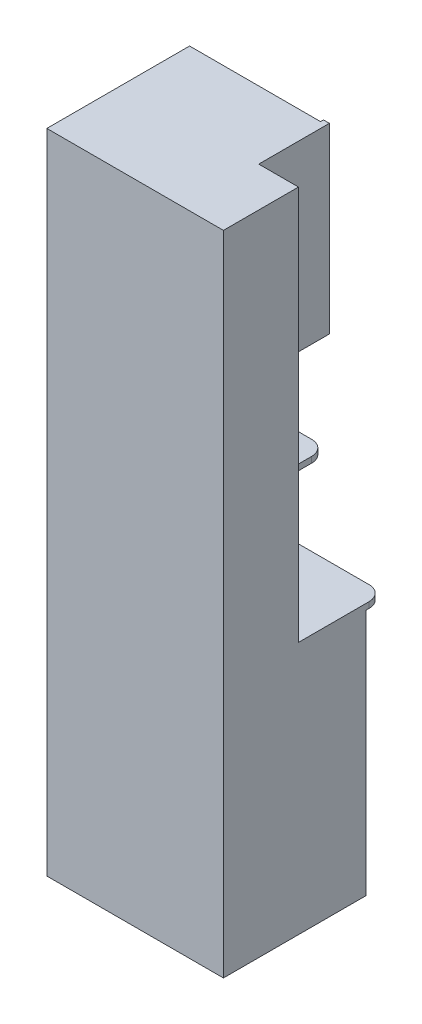
ISO-10303-21;
HEADER;
FILE_DESCRIPTION(('STEP AP214'),'2;1');
FILE_NAME('part.step','',(''),(''),'','','');
FILE_SCHEMA(('AUTOMOTIVE_DESIGN { 1 0 10303 214 1 1 1 1 }'));
ENDSEC;
DATA;
#1=APPLICATION_CONTEXT('core data for automotive mechanical design processes');
#2=APPLICATION_PROTOCOL_DEFINITION('international standard','automotive_design',2000,#1);
#3=PRODUCT_CONTEXT('',#1,'mechanical');
#4=PRODUCT('Part','Part','',(#3));
#5=PRODUCT_RELATED_PRODUCT_CATEGORY('part','',(#4));
#6=PRODUCT_DEFINITION_FORMATION('','',#4);
#7=PRODUCT_DEFINITION_CONTEXT('part definition',#1,'design');
#8=PRODUCT_DEFINITION('design','',#6,#7);
#9=PRODUCT_DEFINITION_SHAPE('','',#8);
#10=(LENGTH_UNIT() NAMED_UNIT(*) SI_UNIT(.MILLI.,.METRE.));
#11=(NAMED_UNIT(*) PLANE_ANGLE_UNIT() SI_UNIT($,.RADIAN.));
#12=(NAMED_UNIT(*) SI_UNIT($,.STERADIAN.) SOLID_ANGLE_UNIT());
#13=UNCERTAINTY_MEASURE_WITH_UNIT(LENGTH_MEASURE(1.E-05),#10,'distance_accuracy_value','');
#14=(GEOMETRIC_REPRESENTATION_CONTEXT(3) GLOBAL_UNCERTAINTY_ASSIGNED_CONTEXT((#13)) GLOBAL_UNIT_ASSIGNED_CONTEXT((#10,
#11,#12)) REPRESENTATION_CONTEXT('',''));
#15=CARTESIAN_POINT('',(0.,0.,0.));
#16=DIRECTION('',(0.,0.,1.));
#17=DIRECTION('',(1.,0.,0.));
#18=AXIS2_PLACEMENT_3D('',#15,#16,#17);
#19=CARTESIAN_POINT('',(165.,1100.,-255.));
#20=DIRECTION('',(0.,0.,1.));
#21=DIRECTION('',(0.,-1.,0.));
#22=AXIS2_PLACEMENT_3D('',#19,#20,#21);
#23=PLANE('',#22);
#24=DIRECTION('',(-1.,0.,0.));
#25=VECTOR('',#24,1.);
#26=CARTESIAN_POINT('',(165.,480.000000000001,-255.));
#27=LINE('',#26,#25);
#28=CARTESIAN_POINT('',(165.,480.000000000001,-255.));
#29=VERTEX_POINT('',#28);
#30=CARTESIAN_POINT('',(145.,480.000000000001,-255.));
#31=VERTEX_POINT('',#30);
#32=EDGE_CURVE('E196',#29,#31,#27,.T.);
#33=ORIENTED_EDGE('',*,*,#32,.F.);
#34=DIRECTION('',(0.,-1.,0.));
#35=VECTOR('',#34,1.);
#36=CARTESIAN_POINT('',(165.,1100.,-255.));
#37=LINE('',#36,#35);
#38=CARTESIAN_POINT('',(165.,1100.,-255.));
#39=VERTEX_POINT('',#38);
#40=EDGE_CURVE('E185',#39,#29,#37,.T.);
#41=ORIENTED_EDGE('',*,*,#40,.F.);
#42=DIRECTION('',(1.,0.,0.));
#43=VECTOR('',#42,1.);
#44=CARTESIAN_POINT('',(165.,1100.,-255.));
#45=LINE('',#44,#43);
#46=CARTESIAN_POINT('',(300.,1100.,-255.));
#47=VERTEX_POINT('',#46);
#48=EDGE_CURVE('E286',#39,#47,#45,.T.);
#49=ORIENTED_EDGE('',*,*,#48,.T.);
#50=DIRECTION('',(0.,-1.,0.));
#51=VECTOR('',#50,1.);
#52=CARTESIAN_POINT('',(300.,1100.,-255.));
#53=LINE('',#52,#51);
#54=CARTESIAN_POINT('',(300.,-240.,-255.));
#55=VERTEX_POINT('',#54);
#56=EDGE_CURVE('E281',#47,#55,#53,.T.);
#57=ORIENTED_EDGE('',*,*,#56,.T.);
#58=DIRECTION('',(1.,0.,0.));
#59=VECTOR('',#58,1.);
#60=CARTESIAN_POINT('',(-280.,-240.,-255.));
#61=LINE('',#60,#59);
#62=CARTESIAN_POINT('',(-280.,-240.,-255.));
#63=VERTEX_POINT('',#62);
#64=EDGE_CURVE('E226',#63,#55,#61,.T.);
#65=ORIENTED_EDGE('',*,*,#64,.F.);
#66=DIRECTION('',(0.,-1.,0.));
#67=VECTOR('',#66,1.);
#68=CARTESIAN_POINT('',(-280.,-260.,-255.));
#69=LINE('',#68,#67);
#70=CARTESIAN_POINT('',(-280.,130.,-255.));
#71=VERTEX_POINT('',#70);
#72=EDGE_CURVE('E273',#71,#63,#69,.T.);
#73=ORIENTED_EDGE('',*,*,#72,.F.);
#74=DIRECTION('',(1.,0.,0.));
#75=VECTOR('',#74,1.);
#76=CARTESIAN_POINT('',(-280.,130.,-255.));
#77=LINE('',#76,#75);
#78=CARTESIAN_POINT('',(165.,130.,-255.));
#79=VERTEX_POINT('',#78);
#80=EDGE_CURVE('E278',#71,#79,#77,.T.);
#81=ORIENTED_EDGE('',*,*,#80,.T.);
#82=DIRECTION('',(0.,-1.,0.));
#83=VECTOR('',#82,1.);
#84=CARTESIAN_POINT('',(165.,1100.,-255.));
#85=LINE('',#84,#83);
#86=CARTESIAN_POINT('',(165.,150.,-255.));
#87=VERTEX_POINT('',#86);
#88=EDGE_CURVE('E283',#87,#79,#85,.T.);
#89=ORIENTED_EDGE('',*,*,#88,.F.);
#90=DIRECTION('',(1.,0.,0.));
#91=VECTOR('',#90,1.);
#92=CARTESIAN_POINT('',(-280.,150.,-255.));
#93=LINE('',#92,#91);
#94=CARTESIAN_POINT('',(-280.,150.,-255.));
#95=VERTEX_POINT('',#94);
#96=EDGE_CURVE('E259',#95,#87,#93,.T.);
#97=ORIENTED_EDGE('',*,*,#96,.F.);
#98=DIRECTION('',(0.,-1.,0.));
#99=VECTOR('',#98,1.);
#100=CARTESIAN_POINT('',(-280.,490.,-255.));
#101=LINE('',#100,#99);
#102=CARTESIAN_POINT('',(-280.,490.,-255.));
#103=VERTEX_POINT('',#102);
#104=EDGE_CURVE('E248',#103,#95,#101,.T.);
#105=ORIENTED_EDGE('',*,*,#104,.F.);
#106=DIRECTION('',(1.,0.,0.));
#107=VECTOR('',#106,1.);
#108=CARTESIAN_POINT('',(-280.,490.,-255.));
#109=LINE('',#108,#107);
#110=CARTESIAN_POINT('',(145.,490.,-255.));
#111=VERTEX_POINT('',#110);
#112=EDGE_CURVE('E261',#103,#111,#109,.T.);
#113=ORIENTED_EDGE('',*,*,#112,.T.);
#114=DIRECTION('',(0.,-1.,0.));
#115=VECTOR('',#114,1.);
#116=CARTESIAN_POINT('',(145.,1100.,-255.));
#117=LINE('',#116,#115);
#118=EDGE_CURVE('E207',#111,#31,#117,.T.);
#119=ORIENTED_EDGE('',*,*,#118,.T.);
#120=EDGE_LOOP('',(#33,#41,#49,#57,#65,#73,#81,#89,#97,#105,#113,#119));
#121=FACE_BOUND('',#120,.T.);
#122=ADVANCED_FACE('F33',(#121),#23,.F.);
#123=CARTESIAN_POINT('',(-280.,0.,0.));
#124=DIRECTION('',(1.,0.,0.));
#125=DIRECTION('',(0.,1.,0.));
#126=AXIS2_PLACEMENT_3D('',#123,#124,#125);
#127=PLANE('',#126);
#128=ORIENTED_EDGE('',*,*,#72,.T.);
#129=DIRECTION('',(0.,0.,-1.));
#130=VECTOR('',#129,1.);
#131=CARTESIAN_POINT('',(-280.,-240.,-1.8376105235175E-13));
#132=LINE('',#131,#130);
#133=CARTESIAN_POINT('',(-280.,-240.,-485.));
#134=VERTEX_POINT('',#133);
#135=EDGE_CURVE('E319',#63,#134,#132,.T.);
#136=ORIENTED_EDGE('',*,*,#135,.T.);
#137=DIRECTION('',(0.,1.,0.));
#138=VECTOR('',#137,1.);
#139=CARTESIAN_POINT('',(-280.,-260.,-485.));
#140=LINE('',#139,#138);
#141=CARTESIAN_POINT('',(-280.,130.,-485.));
#142=VERTEX_POINT('',#141);
#143=EDGE_CURVE('E270',#134,#142,#140,.T.);
#144=ORIENTED_EDGE('',*,*,#143,.T.);
#145=DIRECTION('',(0.,0.,1.));
#146=VECTOR('',#145,1.);
#147=CARTESIAN_POINT('',(-280.,130.,-485.));
#148=LINE('',#147,#146);
#149=EDGE_CURVE('E269',#142,#71,#148,.T.);
#150=ORIENTED_EDGE('',*,*,#149,.T.);
#151=EDGE_LOOP('',(#128,#136,#144,#150));
#152=FACE_BOUND('',#151,.T.);
#153=ADVANCED_FACE('F416',(#152),#127,.T.);
#154=CARTESIAN_POINT('',(165.,0.,0.));
#155=DIRECTION('',(-1.,0.,0.));
#156=DIRECTION('',(0.,-1.,0.));
#157=AXIS2_PLACEMENT_3D('',#154,#155,#156);
#158=PLANE('',#157);
#159=DIRECTION('',(0.,0.,1.));
#160=VECTOR('',#159,1.);
#161=CARTESIAN_POINT('',(165.,130.,-485.));
#162=LINE('',#161,#160);
#163=CARTESIAN_POINT('',(165.,130.,-435.));
#164=VERTEX_POINT('',#163);
#165=EDGE_CURVE('E258',#164,#79,#162,.T.);
#166=ORIENTED_EDGE('',*,*,#165,.F.);
#167=DIRECTION('',(0.,1.,0.));
#168=VECTOR('',#167,1.);
#169=CARTESIAN_POINT('',(165.,150.,-435.));
#170=LINE('',#169,#168);
#171=CARTESIAN_POINT('',(165.,150.,-435.));
#172=VERTEX_POINT('',#171);
#173=EDGE_CURVE('E345',#164,#172,#170,.T.);
#174=ORIENTED_EDGE('',*,*,#173,.T.);
#175=DIRECTION('',(0.,0.,-1.));
#176=VECTOR('',#175,1.);
#177=CARTESIAN_POINT('',(165.,150.,-485.));
#178=LINE('',#177,#176);
#179=EDGE_CURVE('E235',#87,#172,#178,.T.);
#180=ORIENTED_EDGE('',*,*,#179,.F.);
#181=ORIENTED_EDGE('',*,*,#88,.T.);
#182=EDGE_LOOP('',(#166,#174,#180,#181));
#183=FACE_BOUND('',#182,.T.);
#184=ADVANCED_FACE('F352',(#183),#158,.F.);
#185=CARTESIAN_POINT('',(-300.,1100.,-485.));
#186=DIRECTION('',(-1.,0.,0.));
#187=DIRECTION('',(0.,-1.,0.));
#188=AXIS2_PLACEMENT_3D('',#185,#186,#187);
#189=PLANE('',#188);
#190=DIRECTION('',(0.,-1.,0.));
#191=VECTOR('',#190,1.);
#192=CARTESIAN_POINT('',(-300.,1100.,0.));
#193=LINE('',#192,#191);
#194=CARTESIAN_POINT('',(-300.,1100.,0.));
#195=VERTEX_POINT('',#194);
#196=CARTESIAN_POINT('',(-300.,-1100.,0.));
#197=VERTEX_POINT('',#196);
#198=EDGE_CURVE('E292',#195,#197,#193,.T.);
#199=ORIENTED_EDGE('',*,*,#198,.F.);
#200=DIRECTION('',(0.,0.,1.));
#201=VECTOR('',#200,1.);
#202=CARTESIAN_POINT('',(-300.,1100.,-485.));
#203=LINE('',#202,#201);
#204=CARTESIAN_POINT('',(-300.,1100.,-485.));
#205=VERTEX_POINT('',#204);
#206=EDGE_CURVE('E317',#205,#195,#203,.T.);
#207=ORIENTED_EDGE('',*,*,#206,.F.);
#208=DIRECTION('',(0.,-1.,0.));
#209=VECTOR('',#208,1.);
#210=CARTESIAN_POINT('',(-300.,1100.,-485.));
#211=LINE('',#210,#209);
#212=CARTESIAN_POINT('',(-300.,-1100.,-485.));
#213=VERTEX_POINT('',#212);
#214=EDGE_CURVE('E294',#205,#213,#211,.T.);
#215=ORIENTED_EDGE('',*,*,#214,.T.);
#216=DIRECTION('',(0.,0.,1.));
#217=VECTOR('',#216,1.);
#218=CARTESIAN_POINT('',(-300.,-1100.,-485.));
#219=LINE('',#218,#217);
#220=EDGE_CURVE('E306',#213,#197,#219,.T.);
#221=ORIENTED_EDGE('',*,*,#220,.T.);
#222=EDGE_LOOP('',(#199,#207,#215,#221));
#223=FACE_BOUND('',#222,.T.);
#224=ADVANCED_FACE('F441',(#223),#189,.T.);
#225=CARTESIAN_POINT('',(300.,1100.,-485.));
#226=DIRECTION('',(0.,1.,0.));
#227=DIRECTION('',(0.,0.,1.));
#228=AXIS2_PLACEMENT_3D('',#225,#226,#227);
#229=PLANE('',#228);
#230=ORIENTED_EDGE('',*,*,#48,.F.);
#231=DIRECTION('',(0.,0.,1.));
#232=VECTOR('',#231,1.);
#233=CARTESIAN_POINT('',(165.,1100.,-255.));
#234=LINE('',#233,#232);
#235=CARTESIAN_POINT('',(165.,1100.,-495.));
#236=VERTEX_POINT('',#235);
#237=EDGE_CURVE('E202',#236,#39,#234,.T.);
#238=ORIENTED_EDGE('',*,*,#237,.F.);
#239=DIRECTION('',(-1.,0.,0.));
#240=VECTOR('',#239,1.);
#241=CARTESIAN_POINT('',(165.,1100.,-495.));
#242=LINE('',#241,#240);
#243=CARTESIAN_POINT('',(145.,1100.,-495.));
#244=VERTEX_POINT('',#243);
#245=EDGE_CURVE('E197',#236,#244,#242,.T.);
#246=ORIENTED_EDGE('',*,*,#245,.T.);
#247=DIRECTION('',(0.,0.,1.));
#248=VECTOR('',#247,1.);
#249=CARTESIAN_POINT('',(145.,1100.,-255.));
#250=LINE('',#249,#248);
#251=CARTESIAN_POINT('',(145.,1100.,-485.));
#252=VERTEX_POINT('',#251);
#253=EDGE_CURVE('E212',#244,#252,#250,.T.);
#254=ORIENTED_EDGE('',*,*,#253,.T.);
#255=DIRECTION('',(-1.,0.,0.));
#256=VECTOR('',#255,1.);
#257=CARTESIAN_POINT('',(300.,1100.,-485.));
#258=LINE('',#257,#256);
#259=EDGE_CURVE('E304',#252,#205,#258,.T.);
#260=ORIENTED_EDGE('',*,*,#259,.T.);
#261=ORIENTED_EDGE('',*,*,#206,.T.);
#262=DIRECTION('',(-1.,0.,0.));
#263=VECTOR('',#262,1.);
#264=CARTESIAN_POINT('',(300.,1100.,0.));
#265=LINE('',#264,#263);
#266=CARTESIAN_POINT('',(300.,1100.,0.));
#267=VERTEX_POINT('',#266);
#268=EDGE_CURVE('E298',#267,#195,#265,.T.);
#269=ORIENTED_EDGE('',*,*,#268,.F.);
#270=DIRECTION('',(0.,0.,1.));
#271=VECTOR('',#270,1.);
#272=CARTESIAN_POINT('',(300.,1100.,-485.));
#273=LINE('',#272,#271);
#274=EDGE_CURVE('E320',#47,#267,#273,.T.);
#275=ORIENTED_EDGE('',*,*,#274,.F.);
#276=EDGE_LOOP('',(#230,#238,#246,#254,#260,#261,#269,#275));
#277=FACE_BOUND('',#276,.T.);
#278=ADVANCED_FACE('F374',(#277),#229,.T.);
#279=CARTESIAN_POINT('',(300.,1100.,-485.));
#280=DIRECTION('',(1.,0.,0.));
#281=DIRECTION('',(0.,1.,0.));
#282=AXIS2_PLACEMENT_3D('',#279,#280,#281);
#283=PLANE('',#282);
#284=DIRECTION('',(0.,0.,-1.));
#285=VECTOR('',#284,1.);
#286=CARTESIAN_POINT('',(300.,-260.,-255.));
#287=LINE('',#286,#285);
#288=CARTESIAN_POINT('',(300.,-259.999999999999,-485.));
#289=VERTEX_POINT('',#288);
#290=CARTESIAN_POINT('',(300.,-259.999999999999,-495.));
#291=VERTEX_POINT('',#290);
#292=EDGE_CURVE('E237',#289,#291,#287,.T.);
#293=ORIENTED_EDGE('',*,*,#292,.T.);
#294=DIRECTION('',(0.,-1.,0.));
#295=VECTOR('',#294,1.);
#296=CARTESIAN_POINT('',(300.,-239.999999999999,-495.));
#297=LINE('',#296,#295);
#298=CARTESIAN_POINT('',(300.,-239.999999999999,-495.));
#299=VERTEX_POINT('',#298);
#300=EDGE_CURVE('E332',#291,#299,#297,.F.);
#301=ORIENTED_EDGE('',*,*,#300,.T.);
#302=DIRECTION('',(0.,0.,-1.));
#303=VECTOR('',#302,1.);
#304=CARTESIAN_POINT('',(300.,-240.,-255.));
#305=LINE('',#304,#303);
#306=EDGE_CURVE('E229',#55,#299,#305,.T.);
#307=ORIENTED_EDGE('',*,*,#306,.F.);
#308=ORIENTED_EDGE('',*,*,#56,.F.);
#309=ORIENTED_EDGE('',*,*,#274,.T.);
#310=DIRECTION('',(0.,1.,0.));
#311=VECTOR('',#310,1.);
#312=CARTESIAN_POINT('',(300.,1100.,0.));
#313=LINE('',#312,#311);
#314=CARTESIAN_POINT('',(300.,-1100.,0.));
#315=VERTEX_POINT('',#314);
#316=EDGE_CURVE('E312',#315,#267,#313,.T.);
#317=ORIENTED_EDGE('',*,*,#316,.F.);
#318=DIRECTION('',(0.,0.,1.));
#319=VECTOR('',#318,1.);
#320=CARTESIAN_POINT('',(300.,-1100.,-485.));
#321=LINE('',#320,#319);
#322=CARTESIAN_POINT('',(300.,-1100.,-485.));
#323=VERTEX_POINT('',#322);
#324=EDGE_CURVE('E322',#323,#315,#321,.T.);
#325=ORIENTED_EDGE('',*,*,#324,.F.);
#326=DIRECTION('',(0.,1.,0.));
#327=VECTOR('',#326,1.);
#328=CARTESIAN_POINT('',(300.,1100.,-485.));
#329=LINE('',#328,#327);
#330=EDGE_CURVE('E301',#323,#289,#329,.T.);
#331=ORIENTED_EDGE('',*,*,#330,.T.);
#332=EDGE_LOOP('',(#293,#301,#307,#308,#309,#317,#325,#331));
#333=FACE_BOUND('',#332,.T.);
#334=ADVANCED_FACE('F378',(#333),#283,.T.);
#335=CARTESIAN_POINT('',(300.,-1100.,-485.));
#336=DIRECTION('',(0.,-1.,0.));
#337=DIRECTION('',(0.,0.,-1.));
#338=AXIS2_PLACEMENT_3D('',#335,#336,#337);
#339=PLANE('',#338);
#340=DIRECTION('',(1.,0.,0.));
#341=VECTOR('',#340,1.);
#342=CARTESIAN_POINT('',(300.,-1100.,0.));
#343=LINE('',#342,#341);
#344=EDGE_CURVE('E309',#197,#315,#343,.T.);
#345=ORIENTED_EDGE('',*,*,#344,.F.);
#346=ORIENTED_EDGE('',*,*,#220,.F.);
#347=DIRECTION('',(1.,0.,0.));
#348=VECTOR('',#347,1.);
#349=CARTESIAN_POINT('',(300.,-1100.,-485.));
#350=LINE('',#349,#348);
#351=EDGE_CURVE('E297',#213,#323,#350,.T.);
#352=ORIENTED_EDGE('',*,*,#351,.T.);
#353=ORIENTED_EDGE('',*,*,#324,.T.);
#354=EDGE_LOOP('',(#345,#346,#352,#353));
#355=FACE_BOUND('',#354,.T.);
#356=ADVANCED_FACE('F385',(#355),#339,.T.);
#357=CARTESIAN_POINT('',(0.,0.,-485.));
#358=DIRECTION('',(0.,0.,-1.));
#359=DIRECTION('',(-1.,0.,0.));
#360=AXIS2_PLACEMENT_3D('',#357,#358,#359);
#361=PLANE('',#360);
#362=DIRECTION('',(1.,0.,0.));
#363=VECTOR('',#362,1.);
#364=CARTESIAN_POINT('',(-280.,150.,-485.));
#365=LINE('',#364,#363);
#366=CARTESIAN_POINT('',(-280.,150.,-485.));
#367=VERTEX_POINT('',#366);
#368=CARTESIAN_POINT('',(115.,150.,-485.));
#369=VERTEX_POINT('',#368);
#370=EDGE_CURVE('E256',#367,#369,#365,.T.);
#371=ORIENTED_EDGE('',*,*,#370,.T.);
#372=DIRECTION('',(0.,1.,0.));
#373=VECTOR('',#372,1.);
#374=CARTESIAN_POINT('',(115.,130.,-485.));
#375=LINE('',#374,#373);
#376=CARTESIAN_POINT('',(115.,130.,-485.));
#377=VERTEX_POINT('',#376);
#378=EDGE_CURVE('E41',#369,#377,#375,.F.);
#379=ORIENTED_EDGE('',*,*,#378,.T.);
#380=DIRECTION('',(1.,0.,0.));
#381=VECTOR('',#380,1.);
#382=CARTESIAN_POINT('',(-280.,130.,-485.));
#383=LINE('',#382,#381);
#384=EDGE_CURVE('E276',#142,#377,#383,.T.);
#385=ORIENTED_EDGE('',*,*,#384,.F.);
#386=ORIENTED_EDGE('',*,*,#143,.F.);
#387=CARTESIAN_POINT('',(-280.,-259.999999999999,-485.));
#388=VERTEX_POINT('',#387);
#389=EDGE_CURVE('E266',#388,#134,#140,.T.);
#390=ORIENTED_EDGE('',*,*,#389,.F.);
#391=DIRECTION('',(1.,0.,0.));
#392=VECTOR('',#391,1.);
#393=CARTESIAN_POINT('',(165.,-259.999999999999,-485.));
#394=LINE('',#393,#392);
#395=EDGE_CURVE('E289',#388,#289,#394,.T.);
#396=ORIENTED_EDGE('',*,*,#395,.T.);
#397=ORIENTED_EDGE('',*,*,#330,.F.);
#398=ORIENTED_EDGE('',*,*,#351,.F.);
#399=ORIENTED_EDGE('',*,*,#214,.F.);
#400=ORIENTED_EDGE('',*,*,#259,.F.);
#401=DIRECTION('',(0.,1.,0.));
#402=VECTOR('',#401,1.);
#403=CARTESIAN_POINT('',(145.,1100.,-485.));
#404=LINE('',#403,#402);
#405=CARTESIAN_POINT('',(145.,490.,-485.));
#406=VERTEX_POINT('',#405);
#407=EDGE_CURVE('E217',#406,#252,#404,.T.);
#408=ORIENTED_EDGE('',*,*,#407,.F.);
#409=DIRECTION('',(1.,0.,0.));
#410=VECTOR('',#409,1.);
#411=CARTESIAN_POINT('',(-280.,490.,-485.));
#412=LINE('',#411,#410);
#413=CARTESIAN_POINT('',(-280.,490.,-485.));
#414=VERTEX_POINT('',#413);
#415=EDGE_CURVE('E254',#414,#406,#412,.T.);
#416=ORIENTED_EDGE('',*,*,#415,.F.);
#417=DIRECTION('',(0.,1.,0.));
#418=VECTOR('',#417,1.);
#419=CARTESIAN_POINT('',(-280.,490.,-485.));
#420=LINE('',#419,#418);
#421=EDGE_CURVE('E242',#367,#414,#420,.T.);
#422=ORIENTED_EDGE('',*,*,#421,.F.);
#423=EDGE_LOOP('',(#371,#379,#385,#386,#390,#396,#397,#398,#399,#400,#408,#416,#422));
#424=FACE_BOUND('',#423,.T.);
#425=ADVANCED_FACE('F388',(#424),#361,.T.);
#426=CARTESIAN_POINT('',(0.,0.,0.));
#427=DIRECTION('',(0.,0.,-1.));
#428=DIRECTION('',(-1.,0.,0.));
#429=AXIS2_PLACEMENT_3D('',#426,#427,#428);
#430=PLANE('',#429);
#431=ORIENTED_EDGE('',*,*,#198,.T.);
#432=ORIENTED_EDGE('',*,*,#344,.T.);
#433=ORIENTED_EDGE('',*,*,#316,.T.);
#434=ORIENTED_EDGE('',*,*,#268,.T.);
#435=EDGE_LOOP('',(#431,#432,#433,#434));
#436=FACE_BOUND('',#435,.T.);
#437=ADVANCED_FACE('F381',(#436),#430,.F.);
#438=CARTESIAN_POINT('',(-280.,130.,-485.));
#439=DIRECTION('',(0.,1.,0.));
#440=DIRECTION('',(0.,0.,1.));
#441=AXIS2_PLACEMENT_3D('',#438,#439,#440);
#442=PLANE('',#441);
#443=ORIENTED_EDGE('',*,*,#384,.T.);
#444=CARTESIAN_POINT('',(115.,130.,-435.));
#445=DIRECTION('',(0.,1.,0.));
#446=DIRECTION('',(0.,0.,1.));
#447=AXIS2_PLACEMENT_3D('',#444,#445,#446);
#448=CIRCLE('',#447,50.);
#449=EDGE_CURVE('E11',#377,#164,#448,.F.);
#450=ORIENTED_EDGE('',*,*,#449,.T.);
#451=ORIENTED_EDGE('',*,*,#165,.T.);
#452=ORIENTED_EDGE('',*,*,#80,.F.);
#453=ORIENTED_EDGE('',*,*,#149,.F.);
#454=EDGE_LOOP('',(#443,#450,#451,#452,#453));
#455=FACE_BOUND('',#454,.T.);
#456=ADVANCED_FACE('F421',(#455),#442,.F.);
#457=CARTESIAN_POINT('',(-280.,150.,-485.));
#458=DIRECTION('',(0.,-1.,0.));
#459=DIRECTION('',(0.,0.,-1.));
#460=AXIS2_PLACEMENT_3D('',#457,#458,#459);
#461=PLANE('',#460);
#462=ORIENTED_EDGE('',*,*,#179,.T.);
#463=CARTESIAN_POINT('',(115.,150.,-435.));
#464=DIRECTION('',(0.,-1.,0.));
#465=DIRECTION('',(0.,0.,-1.));
#466=AXIS2_PLACEMENT_3D('',#463,#464,#465);
#467=CIRCLE('',#466,50.);
#468=EDGE_CURVE('E55',#172,#369,#467,.F.);
#469=ORIENTED_EDGE('',*,*,#468,.T.);
#470=ORIENTED_EDGE('',*,*,#370,.F.);
#471=DIRECTION('',(0.,0.,-1.));
#472=VECTOR('',#471,1.);
#473=CARTESIAN_POINT('',(-280.,150.,-485.));
#474=LINE('',#473,#472);
#475=EDGE_CURVE('E251',#95,#367,#474,.T.);
#476=ORIENTED_EDGE('',*,*,#475,.F.);
#477=ORIENTED_EDGE('',*,*,#96,.T.);
#478=EDGE_LOOP('',(#462,#469,#470,#476,#477));
#479=FACE_BOUND('',#478,.T.);
#480=ADVANCED_FACE('F356',(#479),#461,.F.);
#481=CARTESIAN_POINT('',(-280.,490.,-485.));
#482=DIRECTION('',(0.,1.,0.));
#483=DIRECTION('',(0.,0.,1.));
#484=AXIS2_PLACEMENT_3D('',#481,#482,#483);
#485=PLANE('',#484);
#486=ORIENTED_EDGE('',*,*,#415,.T.);
#487=DIRECTION('',(0.,0.,-1.));
#488=VECTOR('',#487,1.);
#489=CARTESIAN_POINT('',(145.,490.,-485.));
#490=LINE('',#489,#488);
#491=EDGE_CURVE('E220',#111,#406,#490,.T.);
#492=ORIENTED_EDGE('',*,*,#491,.F.);
#493=ORIENTED_EDGE('',*,*,#112,.F.);
#494=DIRECTION('',(0.,0.,1.));
#495=VECTOR('',#494,1.);
#496=CARTESIAN_POINT('',(-280.,490.,-485.));
#497=LINE('',#496,#495);
#498=EDGE_CURVE('E245',#414,#103,#497,.T.);
#499=ORIENTED_EDGE('',*,*,#498,.F.);
#500=EDGE_LOOP('',(#486,#492,#493,#499));
#501=FACE_BOUND('',#500,.T.);
#502=ADVANCED_FACE('F365',(#501),#485,.F.);
#503=CARTESIAN_POINT('',(-280.,0.,0.));
#504=DIRECTION('',(-1.,0.,0.));
#505=DIRECTION('',(0.,-1.,0.));
#506=AXIS2_PLACEMENT_3D('',#503,#504,#505);
#507=PLANE('',#506);
#508=ORIENTED_EDGE('',*,*,#421,.T.);
#509=ORIENTED_EDGE('',*,*,#498,.T.);
#510=ORIENTED_EDGE('',*,*,#104,.T.);
#511=ORIENTED_EDGE('',*,*,#475,.T.);
#512=EDGE_LOOP('',(#508,#509,#510,#511));
#513=FACE_BOUND('',#512,.T.);
#514=ADVANCED_FACE('F361',(#513),#507,.F.);
#515=CARTESIAN_POINT('',(-280.,-240.,-255.));
#516=DIRECTION('',(1.,0.,0.));
#517=DIRECTION('',(0.,1.,0.));
#518=AXIS2_PLACEMENT_3D('',#515,#516,#517);
#519=PLANE('',#518);
#520=DIRECTION('',(0.,0.,1.));
#521=VECTOR('',#520,1.);
#522=CARTESIAN_POINT('',(-280.,-240.,-255.));
#523=LINE('',#522,#521);
#524=CARTESIAN_POINT('',(-280.,-239.999999999999,-495.));
#525=VERTEX_POINT('',#524);
#526=EDGE_CURVE('E224',#525,#134,#523,.T.);
#527=ORIENTED_EDGE('',*,*,#526,.F.);
#528=DIRECTION('',(0.,-1.,0.));
#529=VECTOR('',#528,1.);
#530=CARTESIAN_POINT('',(-280.,-239.999999999999,-495.));
#531=LINE('',#530,#529);
#532=CARTESIAN_POINT('',(-280.,-259.999999999999,-495.));
#533=VERTEX_POINT('',#532);
#534=EDGE_CURVE('E336',#525,#533,#531,.T.);
#535=ORIENTED_EDGE('',*,*,#534,.T.);
#536=DIRECTION('',(0.,0.,1.));
#537=VECTOR('',#536,1.);
#538=CARTESIAN_POINT('',(-280.,-260.,-255.));
#539=LINE('',#538,#537);
#540=EDGE_CURVE('E223',#533,#388,#539,.T.);
#541=ORIENTED_EDGE('',*,*,#540,.T.);
#542=ORIENTED_EDGE('',*,*,#389,.T.);
#543=EDGE_LOOP('',(#527,#535,#541,#542));
#544=FACE_BOUND('',#543,.T.);
#545=ADVANCED_FACE('F414',(#544),#519,.F.);
#546=CARTESIAN_POINT('',(-280.,-239.999999999999,-545.));
#547=DIRECTION('',(0.,0.,1.));
#548=DIRECTION('',(0.,-1.,0.));
#549=AXIS2_PLACEMENT_3D('',#546,#547,#548);
#550=PLANE('',#549);
#551=DIRECTION('',(-1.,0.,0.));
#552=VECTOR('',#551,1.);
#553=CARTESIAN_POINT('',(-280.,-259.999999999999,-545.));
#554=LINE('',#553,#552);
#555=CARTESIAN_POINT('',(250.,-259.999999999999,-545.));
#556=VERTEX_POINT('',#555);
#557=CARTESIAN_POINT('',(-230.,-259.999999999999,-545.));
#558=VERTEX_POINT('',#557);
#559=EDGE_CURVE('E227',#556,#558,#554,.T.);
#560=ORIENTED_EDGE('',*,*,#559,.T.);
#561=DIRECTION('',(0.,-1.,0.));
#562=VECTOR('',#561,1.);
#563=CARTESIAN_POINT('',(-230.,-239.999999999999,-545.));
#564=LINE('',#563,#562);
#565=CARTESIAN_POINT('',(-230.,-239.999999999999,-545.));
#566=VERTEX_POINT('',#565);
#567=EDGE_CURVE('E341',#558,#566,#564,.F.);
#568=ORIENTED_EDGE('',*,*,#567,.T.);
#569=DIRECTION('',(-1.,0.,0.));
#570=VECTOR('',#569,1.);
#571=CARTESIAN_POINT('',(-280.,-239.999999999999,-545.));
#572=LINE('',#571,#570);
#573=CARTESIAN_POINT('',(250.,-239.999999999999,-545.));
#574=VERTEX_POINT('',#573);
#575=EDGE_CURVE('E232',#574,#566,#572,.T.);
#576=ORIENTED_EDGE('',*,*,#575,.F.);
#577=DIRECTION('',(0.,-1.,0.));
#578=VECTOR('',#577,1.);
#579=CARTESIAN_POINT('',(250.,-259.999999999999,-545.));
#580=LINE('',#579,#578);
#581=EDGE_CURVE('E327',#574,#556,#580,.T.);
#582=ORIENTED_EDGE('',*,*,#581,.T.);
#583=EDGE_LOOP('',(#560,#568,#576,#582));
#584=FACE_BOUND('',#583,.T.);
#585=ADVANCED_FACE('F407',(#584),#550,.F.);
#586=CARTESIAN_POINT('',(0.,-240.,-1.84593303494647E-13));
#587=DIRECTION('',(0.,-1.,0.));
#588=DIRECTION('',(0.,0.,-1.));
#589=AXIS2_PLACEMENT_3D('',#586,#587,#588);
#590=PLANE('',#589);
#591=ORIENTED_EDGE('',*,*,#575,.T.);
#592=CARTESIAN_POINT('',(-230.,-239.999999999999,-495.));
#593=DIRECTION('',(0.,-1.,0.));
#594=DIRECTION('',(0.,0.,-1.));
#595=AXIS2_PLACEMENT_3D('',#592,#593,#594);
#596=CIRCLE('',#595,50.);
#597=EDGE_CURVE('E343',#566,#525,#596,.F.);
#598=ORIENTED_EDGE('',*,*,#597,.T.);
#599=ORIENTED_EDGE('',*,*,#526,.T.);
#600=ORIENTED_EDGE('',*,*,#135,.F.);
#601=ORIENTED_EDGE('',*,*,#64,.T.);
#602=ORIENTED_EDGE('',*,*,#306,.T.);
#603=CARTESIAN_POINT('',(250.,-239.999999999999,-495.));
#604=DIRECTION('',(0.,-1.,0.));
#605=DIRECTION('',(0.,0.,-1.));
#606=AXIS2_PLACEMENT_3D('',#603,#604,#605);
#607=CIRCLE('',#606,50.);
#608=EDGE_CURVE('E334',#299,#574,#607,.F.);
#609=ORIENTED_EDGE('',*,*,#608,.T.);
#610=EDGE_LOOP('',(#591,#598,#599,#600,#601,#602,#609));
#611=FACE_BOUND('',#610,.T.);
#612=ADVANCED_FACE('F404',(#611),#590,.F.);
#613=CARTESIAN_POINT('',(0.,-260.,-1.99074473381062E-13));
#614=DIRECTION('',(0.,-1.,0.));
#615=DIRECTION('',(0.,0.,-1.));
#616=AXIS2_PLACEMENT_3D('',#613,#614,#615);
#617=PLANE('',#616);
#618=ORIENTED_EDGE('',*,*,#540,.F.);
#619=CARTESIAN_POINT('',(-230.,-259.999999999999,-495.));
#620=DIRECTION('',(0.,-1.,0.));
#621=DIRECTION('',(0.,0.,-1.));
#622=AXIS2_PLACEMENT_3D('',#619,#620,#621);
#623=CIRCLE('',#622,50.);
#624=EDGE_CURVE('E339',#533,#558,#623,.T.);
#625=ORIENTED_EDGE('',*,*,#624,.T.);
#626=ORIENTED_EDGE('',*,*,#559,.F.);
#627=CARTESIAN_POINT('',(250.,-259.999999999999,-495.));
#628=DIRECTION('',(0.,-1.,0.));
#629=DIRECTION('',(0.,0.,-1.));
#630=AXIS2_PLACEMENT_3D('',#627,#628,#629);
#631=CIRCLE('',#630,50.);
#632=EDGE_CURVE('E330',#556,#291,#631,.T.);
#633=ORIENTED_EDGE('',*,*,#632,.T.);
#634=ORIENTED_EDGE('',*,*,#292,.F.);
#635=ORIENTED_EDGE('',*,*,#395,.F.);
#636=EDGE_LOOP('',(#618,#625,#626,#633,#634,#635));
#637=FACE_BOUND('',#636,.T.);
#638=ADVANCED_FACE('F395',(#637),#617,.T.);
#639=CARTESIAN_POINT('',(250.,-239.999999999999,-495.));
#640=DIRECTION('',(0.,1.,0.));
#641=DIRECTION('',(0.,0.,1.));
#642=AXIS2_PLACEMENT_3D('',#639,#640,#641);
#643=CYLINDRICAL_SURFACE('',#642,50.);
#644=ORIENTED_EDGE('',*,*,#608,.F.);
#645=ORIENTED_EDGE('',*,*,#300,.F.);
#646=ORIENTED_EDGE('',*,*,#632,.F.);
#647=ORIENTED_EDGE('',*,*,#581,.F.);
#648=EDGE_LOOP('',(#644,#645,#646,#647));
#649=FACE_BOUND('',#648,.T.);
#650=ADVANCED_FACE('F400',(#649),#643,.T.);
#651=CARTESIAN_POINT('',(165.,480.000000000001,-255.));
#652=DIRECTION('',(0.,1.,0.));
#653=DIRECTION('',(-1.,0.,0.));
#654=AXIS2_PLACEMENT_3D('',#651,#652,#653);
#655=PLANE('',#654);
#656=DIRECTION('',(0.,0.,-1.));
#657=VECTOR('',#656,1.);
#658=CARTESIAN_POINT('',(145.,480.000000000001,-255.));
#659=LINE('',#658,#657);
#660=CARTESIAN_POINT('',(145.,480.000000000001,-495.));
#661=VERTEX_POINT('',#660);
#662=EDGE_CURVE('E193',#31,#661,#659,.T.);
#663=ORIENTED_EDGE('',*,*,#662,.T.);
#664=DIRECTION('',(-1.,0.,0.));
#665=VECTOR('',#664,1.);
#666=CARTESIAN_POINT('',(165.,480.000000000001,-495.));
#667=LINE('',#666,#665);
#668=CARTESIAN_POINT('',(165.,480.000000000001,-495.));
#669=VERTEX_POINT('',#668);
#670=EDGE_CURVE('E190',#669,#661,#667,.T.);
#671=ORIENTED_EDGE('',*,*,#670,.F.);
#672=DIRECTION('',(0.,0.,-1.));
#673=VECTOR('',#672,1.);
#674=CARTESIAN_POINT('',(165.,480.000000000001,-255.));
#675=LINE('',#674,#673);
#676=EDGE_CURVE('E178',#29,#669,#675,.T.);
#677=ORIENTED_EDGE('',*,*,#676,.F.);
#678=ORIENTED_EDGE('',*,*,#32,.T.);
#679=EDGE_LOOP('',(#663,#671,#677,#678));
#680=FACE_BOUND('',#679,.T.);
#681=ADVANCED_FACE('F191',(#680),#655,.F.);
#682=CARTESIAN_POINT('',(165.,1100.,-495.));
#683=DIRECTION('',(0.,0.,1.));
#684=DIRECTION('',(0.,-1.,0.));
#685=AXIS2_PLACEMENT_3D('',#682,#683,#684);
#686=PLANE('',#685);
#687=DIRECTION('',(0.,1.,0.));
#688=VECTOR('',#687,1.);
#689=CARTESIAN_POINT('',(145.,1100.,-495.));
#690=LINE('',#689,#688);
#691=EDGE_CURVE('E210',#661,#244,#690,.T.);
#692=ORIENTED_EDGE('',*,*,#691,.T.);
#693=ORIENTED_EDGE('',*,*,#245,.F.);
#694=DIRECTION('',(0.,1.,0.));
#695=VECTOR('',#694,1.);
#696=CARTESIAN_POINT('',(165.,1100.,-495.));
#697=LINE('',#696,#695);
#698=EDGE_CURVE('E183',#669,#236,#697,.T.);
#699=ORIENTED_EDGE('',*,*,#698,.F.);
#700=ORIENTED_EDGE('',*,*,#670,.T.);
#701=EDGE_LOOP('',(#692,#693,#699,#700));
#702=FACE_BOUND('',#701,.T.);
#703=ADVANCED_FACE('F199',(#702),#686,.F.);
#704=CARTESIAN_POINT('',(165.,0.,0.));
#705=DIRECTION('',(1.,0.,0.));
#706=DIRECTION('',(0.,1.,0.));
#707=AXIS2_PLACEMENT_3D('',#704,#705,#706);
#708=PLANE('',#707);
#709=ORIENTED_EDGE('',*,*,#40,.T.);
#710=ORIENTED_EDGE('',*,*,#676,.T.);
#711=ORIENTED_EDGE('',*,*,#698,.T.);
#712=ORIENTED_EDGE('',*,*,#237,.T.);
#713=EDGE_LOOP('',(#709,#710,#711,#712));
#714=FACE_BOUND('',#713,.T.);
#715=ADVANCED_FACE('F180',(#714),#708,.T.);
#716=CARTESIAN_POINT('',(145.,0.,0.));
#717=DIRECTION('',(1.,0.,0.));
#718=DIRECTION('',(0.,1.,0.));
#719=AXIS2_PLACEMENT_3D('',#716,#717,#718);
#720=PLANE('',#719);
#721=ORIENTED_EDGE('',*,*,#407,.T.);
#722=ORIENTED_EDGE('',*,*,#253,.F.);
#723=ORIENTED_EDGE('',*,*,#691,.F.);
#724=ORIENTED_EDGE('',*,*,#662,.F.);
#725=ORIENTED_EDGE('',*,*,#118,.F.);
#726=ORIENTED_EDGE('',*,*,#491,.T.);
#727=EDGE_LOOP('',(#721,#722,#723,#724,#725,#726));
#728=FACE_BOUND('',#727,.T.);
#729=ADVANCED_FACE('F368',(#728),#720,.F.);
#730=CARTESIAN_POINT('',(-230.,-239.999999999999,-495.));
#731=DIRECTION('',(0.,-1.,0.));
#732=DIRECTION('',(0.,0.,-1.));
#733=AXIS2_PLACEMENT_3D('',#730,#731,#732);
#734=CYLINDRICAL_SURFACE('',#733,50.);
#735=ORIENTED_EDGE('',*,*,#597,.F.);
#736=ORIENTED_EDGE('',*,*,#567,.F.);
#737=ORIENTED_EDGE('',*,*,#624,.F.);
#738=ORIENTED_EDGE('',*,*,#534,.F.);
#739=EDGE_LOOP('',(#735,#736,#737,#738));
#740=FACE_BOUND('',#739,.T.);
#741=ADVANCED_FACE('F410',(#740),#734,.T.);
#742=CARTESIAN_POINT('',(115.,0.,-435.));
#743=DIRECTION('',(0.,-1.,0.));
#744=DIRECTION('',(1.,0.,0.));
#745=AXIS2_PLACEMENT_3D('',#742,#743,#744);
#746=CYLINDRICAL_SURFACE('',#745,50.);
#747=ORIENTED_EDGE('',*,*,#449,.F.);
#748=ORIENTED_EDGE('',*,*,#378,.F.);
#749=ORIENTED_EDGE('',*,*,#468,.F.);
#750=ORIENTED_EDGE('',*,*,#173,.F.);
#751=EDGE_LOOP('',(#747,#748,#749,#750));
#752=FACE_BOUND('',#751,.T.);
#753=ADVANCED_FACE('F35',(#752),#746,.T.);
#754=CLOSED_SHELL('',(#122,#153,#184,#224,#278,#334,#356,#425,#437,#456,#480,#502,#514,#545,
#585,#612,#638,#650,#681,#703,#715,#729,#741,#753));
#755=MANIFOLD_SOLID_BREP('B2',#754);
#756=ADVANCED_BREP_SHAPE_REPRESENTATION('',(#18,#755),#14);
#757=SHAPE_DEFINITION_REPRESENTATION(#9,#756);
ENDSEC;
END-ISO-10303-21;
